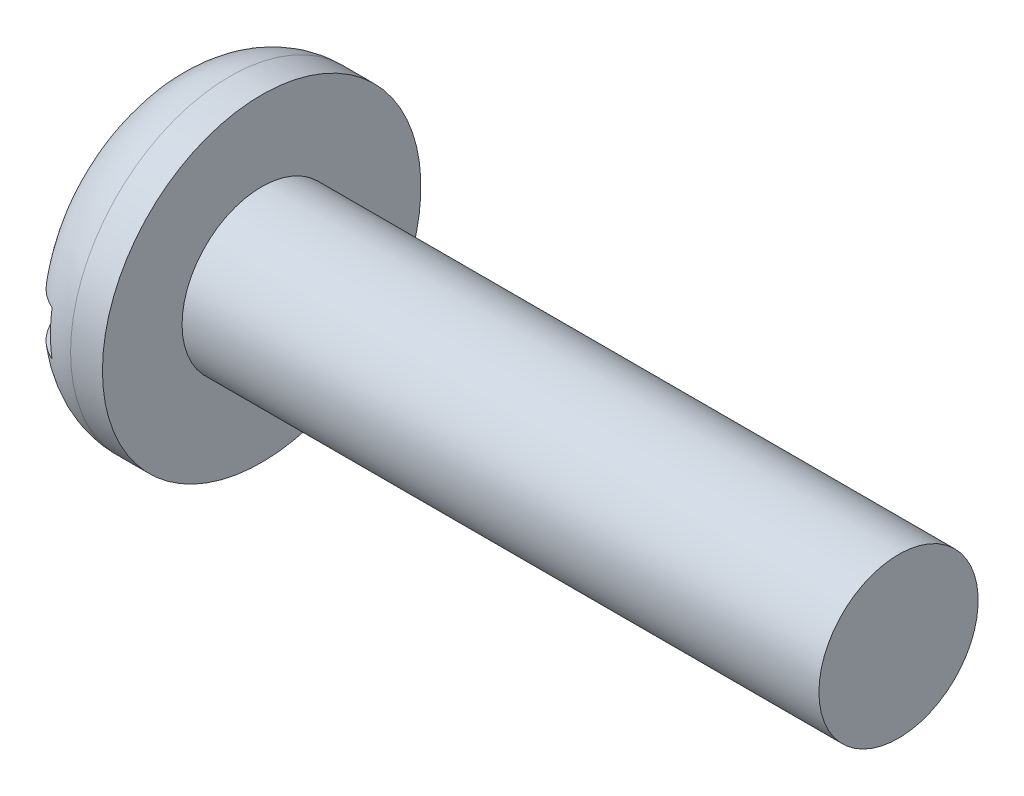
ISO-10303-21;
HEADER;
FILE_DESCRIPTION(('STEP AP214'),'2;1');
FILE_NAME('part.step','',(''),(''),'','','');
FILE_SCHEMA(('AUTOMOTIVE_DESIGN { 1 0 10303 214 1 1 1 1 }'));
ENDSEC;
DATA;
#1=APPLICATION_CONTEXT('core data for automotive mechanical design processes');
#2=APPLICATION_PROTOCOL_DEFINITION('international standard','automotive_design',2000,#1);
#3=PRODUCT_CONTEXT('',#1,'mechanical');
#4=PRODUCT('Part','Part','',(#3));
#5=PRODUCT_RELATED_PRODUCT_CATEGORY('part','',(#4));
#6=PRODUCT_DEFINITION_FORMATION('','',#4);
#7=PRODUCT_DEFINITION_CONTEXT('part definition',#1,'design');
#8=PRODUCT_DEFINITION('design','',#6,#7);
#9=PRODUCT_DEFINITION_SHAPE('','',#8);
#10=(LENGTH_UNIT() NAMED_UNIT(*) SI_UNIT(.MILLI.,.METRE.));
#11=(NAMED_UNIT(*) PLANE_ANGLE_UNIT() SI_UNIT($,.RADIAN.));
#12=(NAMED_UNIT(*) SI_UNIT($,.STERADIAN.) SOLID_ANGLE_UNIT());
#13=UNCERTAINTY_MEASURE_WITH_UNIT(LENGTH_MEASURE(1.E-05),#10,'distance_accuracy_value','');
#14=(GEOMETRIC_REPRESENTATION_CONTEXT(3) GLOBAL_UNCERTAINTY_ASSIGNED_CONTEXT((#13)) GLOBAL_UNIT_ASSIGNED_CONTEXT((#10,
#11,#12)) REPRESENTATION_CONTEXT('',''));
#15=CARTESIAN_POINT('',(0.,0.,0.));
#16=DIRECTION('',(0.,0.,1.));
#17=DIRECTION('',(1.,0.,0.));
#18=AXIS2_PLACEMENT_3D('',#15,#16,#17);
#19=CARTESIAN_POINT('',(0.,0.,0.));
#20=DIRECTION('',(-1.,0.,0.));
#21=DIRECTION('',(0.,0.,1.));
#22=AXIS2_PLACEMENT_3D('',#19,#20,#21);
#23=PLANE('',#22);
#24=DIRECTION('',(0.,0.,-1.));
#25=VECTOR('',#24,1.);
#26=CARTESIAN_POINT('',(0.,1.4,10.));
#27=LINE('',#26,#25);
#28=CARTESIAN_POINT('',(0.,1.4,5.83438085832593));
#29=VERTEX_POINT('',#28);
#30=CARTESIAN_POINT('',(0.,1.4,-5.83438085832593));
#31=VERTEX_POINT('',#30);
#32=EDGE_CURVE('E89',#29,#31,#27,.T.);
#33=ORIENTED_EDGE('',*,*,#32,.F.);
#34=CARTESIAN_POINT('',(0.,0.,0.));
#35=DIRECTION('',(-1.,0.,0.));
#36=DIRECTION('',(0.,0.,1.));
#37=AXIS2_PLACEMENT_3D('',#34,#35,#36);
#38=CIRCLE('',#37,6.);
#39=EDGE_CURVE('E95',#29,#31,#38,.T.);
#40=ORIENTED_EDGE('',*,*,#39,.T.);
#41=EDGE_LOOP('',(#33,#40));
#42=FACE_BOUND('',#41,.T.);
#43=ADVANCED_FACE('F32',(#42),#23,.T.);
#44=CARTESIAN_POINT('',(-25.4,0.,0.));
#45=DIRECTION('',(-1.,0.,0.));
#46=DIRECTION('',(0.,0.,1.));
#47=AXIS2_PLACEMENT_3D('',#44,#45,#46);
#48=CYLINDRICAL_SURFACE('',#47,5.);
#49=CARTESIAN_POINT('',(46.,0.,0.));
#50=DIRECTION('',(-1.,0.,0.));
#51=DIRECTION('',(0.,0.,1.));
#52=AXIS2_PLACEMENT_3D('',#49,#50,#51);
#53=CIRCLE('',#52,5.);
#54=CARTESIAN_POINT('',(46.,0.,5.));
#55=VERTEX_POINT('',#54);
#56=EDGE_CURVE('E99',#55,#55,#53,.T.);
#57=ORIENTED_EDGE('',*,*,#56,.T.);
#58=EDGE_LOOP('',(#57));
#59=FACE_BOUND('',#58,.T.);
#60=CARTESIAN_POINT('',(6.,0.,0.));
#61=DIRECTION('',(-1.,0.,0.));
#62=DIRECTION('',(0.,0.,1.));
#63=AXIS2_PLACEMENT_3D('',#60,#61,#62);
#64=CIRCLE('',#63,5.);
#65=CARTESIAN_POINT('',(6.,0.,5.));
#66=VERTEX_POINT('',#65);
#67=EDGE_CURVE('E131',#66,#66,#64,.T.);
#68=ORIENTED_EDGE('',*,*,#67,.F.);
#69=EDGE_LOOP('',(#68));
#70=FACE_BOUND('',#69,.T.);
#71=ADVANCED_FACE('F34',(#59,#70),#48,.T.);
#72=CARTESIAN_POINT('',(46.,5.,0.));
#73=DIRECTION('',(1.,0.,0.));
#74=DIRECTION('',(0.,0.,-1.));
#75=AXIS2_PLACEMENT_3D('',#72,#73,#74);
#76=PLANE('',#75);
#77=ORIENTED_EDGE('',*,*,#56,.F.);
#78=EDGE_LOOP('',(#77));
#79=FACE_BOUND('',#78,.T.);
#80=ADVANCED_FACE('F150',(#79),#76,.T.);
#81=DIRECTION('',(0.,0.,1.));
#82=VECTOR('',#81,1.);
#83=CARTESIAN_POINT('',(0.,-1.4,-10.));
#84=LINE('',#83,#82);
#85=CARTESIAN_POINT('',(0.,-1.4,-5.83438085832593));
#86=VERTEX_POINT('',#85);
#87=CARTESIAN_POINT('',(0.,-1.4,5.83438085832593));
#88=VERTEX_POINT('',#87);
#89=EDGE_CURVE('E77',#86,#88,#84,.T.);
#90=ORIENTED_EDGE('',*,*,#89,.F.);
#91=EDGE_CURVE('E88',#86,#88,#38,.T.);
#92=ORIENTED_EDGE('',*,*,#91,.T.);
#93=EDGE_LOOP('',(#90,#92));
#94=FACE_BOUND('',#93,.T.);
#95=ADVANCED_FACE('F87',(#94),#23,.T.);
#96=CARTESIAN_POINT('',(4.,0.,0.));
#97=DIRECTION('',(-1.,0.,0.));
#98=DIRECTION('',(0.,0.,1.));
#99=AXIS2_PLACEMENT_3D('',#96,#97,#98);
#100=TOROIDAL_SURFACE('',#99,6.,4.);
#101=CARTESIAN_POINT('',(2.82388760989723,1.4,1.66688763160971));
#102=CARTESIAN_POINT('',(2.99591057931466,1.4,1.59780455340578));
#103=CARTESIAN_POINT('',(3.17324641192669,1.4,1.54138487693918));
#104=CARTESIAN_POINT('',(3.44431983382494,1.4,1.48071678656984));
#105=CARTESIAN_POINT('',(3.53545417429692,1.4,1.46449078681347));
#106=CARTESIAN_POINT('',(3.71886318682712,1.4,1.44064962920626));
#107=CARTESIAN_POINT('',(3.81113770290447,1.4,1.43303330641557));
#108=CARTESIAN_POINT('',(3.99350456293142,1.4,1.42687715764122));
#109=CARTESIAN_POINT('',(4.08358896143869,1.4,1.4280990747782));
#110=CARTESIAN_POINT('',(4.26324158970575,1.4,1.43899537591463));
#111=CARTESIAN_POINT('',(4.3528098095658,1.4,1.44866992148694));
#112=CARTESIAN_POINT('',(4.5308965020747,1.4,1.47606318963219));
#113=CARTESIAN_POINT('',(4.61941221388457,1.4,1.49379966160814));
#114=CARTESIAN_POINT('',(4.79464932813321,1.4,1.53664349533482));
#115=CARTESIAN_POINT('',(4.88137015134344,1.4,1.56175319799052));
#116=CARTESIAN_POINT('',(5.07409548385438,1.4,1.62572381254825));
#117=CARTESIAN_POINT('',(5.17947939906256,1.4,1.66645421365545));
#118=CARTESIAN_POINT('',(5.38629884086466,1.4,1.75692315227251));
#119=CARTESIAN_POINT('',(5.48773323670351,1.4,1.80666424685421));
#120=CARTESIAN_POINT('',(5.68639921418838,1.4,1.9141326618098));
#121=CARTESIAN_POINT('',(5.78362651992467,1.4,1.97186786792857));
#122=CARTESIAN_POINT('',(5.97343201594497,1.4,2.09445578402094));
#123=CARTESIAN_POINT('',(6.06601059667279,1.4,2.15930789478741));
#124=CARTESIAN_POINT('',(6.3410225134084,1.4,2.36717873800974));
#125=CARTESIAN_POINT('',(6.51565728465416,1.4,2.52072958391096));
#126=CARTESIAN_POINT('',(6.84075526935749,1.4,2.85122113548486));
#127=CARTESIAN_POINT('',(6.991232882299,1.4,3.02814779188773));
#128=CARTESIAN_POINT('',(7.28585358037441,1.4,3.43133954884758));
#129=CARTESIAN_POINT('',(7.42540235908466,1.4,3.66100173289964));
#130=CARTESIAN_POINT('',(7.6621109677968,1.4,4.14138729339455));
#131=CARTESIAN_POINT('',(7.75925712914974,1.4,4.39211743016037));
#132=CARTESIAN_POINT('',(7.90345477277527,1.4,4.896570698268));
#133=CARTESIAN_POINT('',(7.95238998776062,1.4,5.14975345905324));
#134=CARTESIAN_POINT('',(8.0041504590733,1.4,5.66077776020977));
#135=CARTESIAN_POINT('',(8.00699532123856,1.4,5.91861727297005));
#136=CARTESIAN_POINT('',(7.96674840043548,1.4,6.41533887586256));
#137=CARTESIAN_POINT('',(7.92635894202319,1.4,6.65444141983588));
#138=CARTESIAN_POINT('',(7.80439510659358,1.4,7.12191135677228));
#139=CARTESIAN_POINT('',(7.72282979237482,1.4,7.35028109993771));
#140=CARTESIAN_POINT('',(7.52443658158668,1.4,7.78063057354644));
#141=CARTESIAN_POINT('',(7.40906711365287,1.4,7.98328350452566));
#142=CARTESIAN_POINT('',(7.14522379940092,1.4,8.36575641080852));
#143=CARTESIAN_POINT('',(6.99675450485219,1.4,8.54557952025606));
#144=CARTESIAN_POINT('',(6.67451507380168,1.4,8.87321576798165));
#145=CARTESIAN_POINT('',(6.50136764199799,1.4,9.02164171151668));
#146=CARTESIAN_POINT('',(6.13235201765611,1.4,9.28688671015458));
#147=CARTESIAN_POINT('',(5.93648551246568,1.4,9.40370811038515));
#148=CARTESIAN_POINT('',(5.53018839943264,1.4,9.60100138395724));
#149=CARTESIAN_POINT('',(5.31996441716839,1.4,9.68189897140146));
#150=CARTESIAN_POINT('',(4.88887041298351,1.4,9.80700967214181));
#151=CARTESIAN_POINT('',(4.66800081274368,1.4,9.85122423721807));
#152=CARTESIAN_POINT('',(4.22332236587566,1.4,9.90150065484593));
#153=CARTESIAN_POINT('',(3.99953945469416,1.4,9.907792172745));
#154=CARTESIAN_POINT('',(3.55410513639755,1.4,9.88265209160338));
#155=CARTESIAN_POINT('',(3.33245369449512,1.4,9.85122110928176));
#156=CARTESIAN_POINT('',(2.89792053757131,1.4,9.75163965230925));
#157=CARTESIAN_POINT('',(2.68502592494758,1.4,9.68354542652615));
#158=CARTESIAN_POINT('',(2.27364991979039,1.4,9.51267018492167));
#159=CARTESIAN_POINT('',(2.07516856849607,1.4,9.40988906985912));
#160=CARTESIAN_POINT('',(1.69766712151978,1.4,9.17232718829837));
#161=CARTESIAN_POINT('',(1.51869880448473,1.4,9.03746416680455));
#162=CARTESIAN_POINT('',(1.18574635195351,1.4,8.7398042150448));
#163=CARTESIAN_POINT('',(1.03176275117384,1.4,8.57700668708509));
#164=CARTESIAN_POINT('',(0.751887385702655,1.4,8.2268843068634));
#165=CARTESIAN_POINT('',(0.626208203043075,1.4,8.03938958754564));
#166=CARTESIAN_POINT('',(0.407636138992179,1.4,7.64619129053692));
#167=CARTESIAN_POINT('',(0.314744623747328,1.4,7.44048695456202));
#168=CARTESIAN_POINT('',(0.162915294710625,1.4,7.01375108185335));
#169=CARTESIAN_POINT('',(0.10445804200566,1.4,6.7925487133289));
#170=CARTESIAN_POINT('',(0.0246071874035577,1.4,6.34357039344767));
#171=CARTESIAN_POINT('',(0.00321715217936811,1.4,6.11579381165209));
#172=CARTESIAN_POINT('',(-0.00260977870431626,1.4,5.65445815132924));
#173=CARTESIAN_POINT('',(0.0138288972861322,1.4,5.42088837535504));
#174=CARTESIAN_POINT('',(0.0842064096773137,1.4,4.95952659740874));
#175=CARTESIAN_POINT('',(0.138146650916431,1.4,4.73173481221612));
#176=CARTESIAN_POINT('',(0.28394368538233,1.4,4.27900664215998));
#177=CARTESIAN_POINT('',(0.377170911905739,1.4,4.05451217585329));
#178=CARTESIAN_POINT('',(0.598005513985871,1.4,3.62307062595052));
#179=CARTESIAN_POINT('',(0.725636172487096,1.4,3.41613555104563));
#180=CARTESIAN_POINT('',(1.01956818834906,1.4,3.01282914246515));
#181=CARTESIAN_POINT('',(1.18768936869895,1.4,2.81777574721764));
#182=CARTESIAN_POINT('',(1.46132201501043,1.4,2.54744642868095));
#183=CARTESIAN_POINT('',(1.55610821335556,1.4,2.46104499674265));
#184=CARTESIAN_POINT('',(1.75234214539796,1.4,2.29618994189214));
#185=CARTESIAN_POINT('',(1.85378794357565,1.4,2.21773402643465));
#186=CARTESIAN_POINT('',(2.09295468801349,1.4,2.04817600435863));
#187=CARTESIAN_POINT('',(2.23271858893909,1.4,1.95992449249366));
#188=CARTESIAN_POINT('',(2.52154246073754,1.4,1.80005555771968));
#189=CARTESIAN_POINT('',(2.67060589008168,1.4,1.72844437064934));
#190=CARTESIAN_POINT('',(2.82388760989723,1.4,1.66688763160971));
#191=B_SPLINE_CURVE_WITH_KNOTS('',3,(#101,#102,#103,#104,#105,#106,#107,#108,#109,#110,#111,
#112,#113,#114,#115,#116,#117,#118,#119,#120,#121,#122,#123,#124,#125,#126,#127,#128,#129,#130,
#131,#132,#133,#134,#135,#136,#137,#138,#139,#140,#141,#142,#143,#144,#145,#146,#147,#148,#149,
#150,#151,#152,#153,#154,#155,#156,#157,#158,#159,#160,#161,#162,#163,#164,#165,#166,#167,#168,
#169,#170,#171,#172,#173,#174,#175,#176,#177,#178,#179,#180,#181,#182,#183,#184,#185,#186,#187,
#188,#189,#190),.UNSPECIFIED.,.T.,.F.,(4,2,2,2,2,2,2,2,2,2,2,2,2,2,2,2,2,2,2,2,2,2,2,2,2,2,2,2,
2,2,2,2,2,2,2,2,2,2,2,2,2,2,2,2,4),(0.,0.555533385012558,0.832895191919914,1.11021946565253,
1.38009618381553,1.64997806081267,1.92045701840144,2.19102194256493,2.52946853416189,
2.86801132166873,3.20689047401699,3.54574111632514,4.24063810101547,4.93511932438331,
5.73720882308924,6.53955668786285,7.30913863277699,8.07839320559907,8.80222860269583,
9.52590475316601,10.222069512648,10.9181385970363,11.599020499766,12.279851865672,
12.9523844545816,13.6248904258361,14.2933195158243,14.961737677922,15.6291332606744,
16.2965307528997,16.9656581909705,17.6347999476467,18.3088111278799,18.9828503884677,
19.6660863186296,20.3493879873063,21.048663717449,21.7479656444268,22.4739960680922,
23.2005190807562,23.9693716313431,24.3537991474319,24.7381154254979,25.2329404227145,
25.7279505539666),.UNSPECIFIED.);
#192=CARTESIAN_POINT('',(2.4,1.4,9.56413752889282));
#193=VERTEX_POINT('',#192);
#194=EDGE_CURVE('E11',#193,#29,#191,.T.);
#195=ORIENTED_EDGE('',*,*,#194,.F.);
#196=CARTESIAN_POINT('',(2.4,0.,0.));
#197=DIRECTION('',(1.,0.,0.));
#198=DIRECTION('',(0.,0.,-1.));
#199=AXIS2_PLACEMENT_3D('',#196,#197,#198);
#200=CIRCLE('',#199,9.66606055596467);
#201=CARTESIAN_POINT('',(2.4,-1.4,9.56413752889282));
#202=VERTEX_POINT('',#201);
#203=EDGE_CURVE('E107',#202,#193,#200,.F.);
#204=ORIENTED_EDGE('',*,*,#203,.F.);
#205=CARTESIAN_POINT('',(2.82388760989723,-1.4,1.66688763160971));
#206=CARTESIAN_POINT('',(2.71540202452825,-1.4,1.71047129507595));
#207=CARTESIAN_POINT('',(2.60898579971927,-1.4,1.75910359728885));
#208=CARTESIAN_POINT('',(2.40061681431915,-1.4,1.8652179313395));
#209=CARTESIAN_POINT('',(2.29866610921061,-1.4,1.92270398470915));
#210=CARTESIAN_POINT('',(2.09948783374248,-1.4,2.04561495646489));
#211=CARTESIAN_POINT('',(2.00226689250272,-1.4,2.11105059197466));
#212=CARTESIAN_POINT('',(1.81307952903431,-1.4,2.2490440890604));
#213=CARTESIAN_POINT('',(1.72111244166065,-1.4,2.32160104589202));
#214=CARTESIAN_POINT('',(1.44651086463947,-1.4,2.55519423519793));
#215=CARTESIAN_POINT('',(1.27305430967287,-1.4,2.72726611619553));
#216=CARTESIAN_POINT('',(0.954530662924008,-1.4,3.0956226000233));
#217=CARTESIAN_POINT('',(0.809446962600361,-1.4,3.29189292749512));
#218=CARTESIAN_POINT('',(0.539044562280082,-1.4,3.72510352655762));
#219=CARTESIAN_POINT('',(0.41705555801857,-1.4,3.96414444235658));
#220=CARTESIAN_POINT('',(0.217486658638567,-1.4,4.46022105745683));
#221=CARTESIAN_POINT('',(0.139912460522645,-1.4,4.71725906046682));
#222=CARTESIAN_POINT('',(0.036055062269157,-1.4,5.22733248554926));
#223=CARTESIAN_POINT('',(0.00727059096522792,-1.4,5.47985761753711));
#224=CARTESIAN_POINT('',(-0.00483928123417192,-1.4,5.98598968892168));
#225=CARTESIAN_POINT('',(0.0118179352155955,-1.4,6.23959617761553));
#226=CARTESIAN_POINT('',(0.0887000066358876,-1.4,6.7257703033764));
#227=CARTESIAN_POINT('',(0.146473078364667,-1.4,6.95872713267903));
#228=CARTESIAN_POINT('',(0.301685409429632,-1.4,7.41103618882651));
#229=CARTESIAN_POINT('',(0.39911653101937,-1.4,7.63039119610125));
#230=CARTESIAN_POINT('',(0.627106210559754,-1.4,8.0414555283909));
#231=CARTESIAN_POINT('',(0.756432217422359,-1.4,8.23384917241329));
#232=CARTESIAN_POINT('',(1.04614095994533,-1.4,8.59363288623071));
#233=CARTESIAN_POINT('',(1.20652002509892,-1.4,8.76102590698964));
#234=CARTESIAN_POINT('',(1.55036681645604,-1.4,9.06271575994388));
#235=CARTESIAN_POINT('',(1.73332861420307,-1.4,9.1975895217532));
#236=CARTESIAN_POINT('',(2.1194964956693,-1.4,9.43431460172465));
#237=CARTESIAN_POINT('',(2.32270123960453,-1.4,9.53616810344438));
#238=CARTESIAN_POINT('',(2.74123726076805,-1.4,9.70289102504211));
#239=CARTESIAN_POINT('',(2.95641615685049,-1.4,9.76814316548236));
#240=CARTESIAN_POINT('',(3.3946994714422,-1.4,9.86139308154713));
#241=CARTESIAN_POINT('',(3.6178036226189,-1.4,9.88939211256069));
#242=CARTESIAN_POINT('',(4.06441079255521,-1.4,9.90726099005743));
#243=CARTESIAN_POINT('',(4.28790623122317,-1.4,9.89732089974912));
#244=CARTESIAN_POINT('',(4.73004701765736,-1.4,9.84003162995927));
#245=CARTESIAN_POINT('',(4.9486924236467,-1.4,9.79268289980676));
#246=CARTESIAN_POINT('',(5.3747961063765,-1.4,9.66201128354121));
#247=CARTESIAN_POINT('',(5.58226150365084,-1.4,9.57871160657014));
#248=CARTESIAN_POINT('',(5.98032786833186,-1.4,9.37858070115127));
#249=CARTESIAN_POINT('',(6.17092872811788,-1.4,9.26174925874149));
#250=CARTESIAN_POINT('',(6.53061319778244,-1.4,8.99748598291685));
#251=CARTESIAN_POINT('',(6.69961881480171,-1.4,8.84994802634061));
#252=CARTESIAN_POINT('',(7.01070808059898,-1.4,8.52880560641576));
#253=CARTESIAN_POINT('',(7.15279100727618,-1.4,8.35520044413531));
#254=CARTESIAN_POINT('',(7.40735991456534,-1.4,7.98533317595888));
#255=CARTESIAN_POINT('',(7.51958543397574,-1.4,7.78889187795062));
#256=CARTESIAN_POINT('',(7.71001696655518,-1.4,7.38017669392034));
#257=CARTESIAN_POINT('',(7.78822142316333,-1.4,7.16790208399947));
#258=CARTESIAN_POINT('',(7.90980483053305,-1.4,6.73009505041085));
#259=CARTESIAN_POINT('',(7.95262978055221,-1.4,6.50440895460741));
#260=CARTESIAN_POINT('',(8.00079716532158,-1.4,6.04909194258102));
#261=CARTESIAN_POINT('',(8.00613567333647,-1.4,5.8194606156174));
#262=CARTESIAN_POINT('',(7.97952886859071,-1.4,5.35637788278586));
#263=CARTESIAN_POINT('',(7.94660783178718,-1.4,5.12298297834878));
#264=CARTESIAN_POINT('',(7.84366216557161,-1.4,4.66457814281171));
#265=CARTESIAN_POINT('',(7.77363428064585,-1.4,4.4395689492737));
#266=CARTESIAN_POINT('',(7.59554777045382,-1.4,3.99405428467082));
#267=CARTESIAN_POINT('',(7.48600437908181,-1.4,3.77414292976772));
#268=CARTESIAN_POINT('',(7.23359578076122,-1.4,3.35435833751963));
#269=CARTESIAN_POINT('',(7.09071366955495,-1.4,3.15449533936725));
#270=CARTESIAN_POINT('',(6.76629368371998,-1.4,2.76755988242133));
#271=CARTESIAN_POINT('',(6.58293445043259,-1.4,2.58200264152373));
#272=CARTESIAN_POINT('',(6.28727477861863,-1.4,2.32796845748048));
#273=CARTESIAN_POINT('',(6.18520562127548,-1.4,2.24729246178138));
#274=CARTESIAN_POINT('',(5.97464493240289,-1.4,2.09477363099254));
#275=CARTESIAN_POINT('',(5.86615500521046,-1.4,2.02292860302699));
#276=CARTESIAN_POINT('',(5.66925974150727,-1.4,1.90473580543983));
#277=CARTESIAN_POINT('',(5.5820759247845,-1.4,1.85635056700798));
#278=CARTESIAN_POINT('',(5.40447794304204,-1.4,1.76601481986021));
#279=CARTESIAN_POINT('',(5.3140639537142,-1.4,1.72406396182779));
#280=CARTESIAN_POINT('',(5.03859810655785,-1.4,1.60919639121585));
#281=CARTESIAN_POINT('',(4.84876547853246,-1.4,1.5469220785411));
#282=CARTESIAN_POINT('',(4.57410858481204,-1.4,1.48460548202786));
#283=CARTESIAN_POINT('',(4.4925383258292,-1.4,1.46944399183204));
#284=CARTESIAN_POINT('',(4.32843200209568,-1.4,1.44597569621881));
#285=CARTESIAN_POINT('',(4.24589649609836,-1.4,1.43766510662425));
#286=CARTESIAN_POINT('',(4.08047397493977,-1.4,1.42822487288097));
#287=CARTESIAN_POINT('',(3.99758725753037,-1.4,1.42709003414336));
#288=CARTESIAN_POINT('',(3.83204246245769,-1.4,1.43202135926205));
#289=CARTESIAN_POINT('',(3.74938438241384,-1.4,1.43808744785738));
#290=CARTESIAN_POINT('',(3.52259683659682,-1.4,1.46445228987051));
#291=CARTESIAN_POINT('',(3.37927427323706,-1.4,1.49204691003426));
#292=CARTESIAN_POINT('',(3.09752035444667,-1.4,1.566090404254));
#293=CARTESIAN_POINT('',(2.95909676596666,-1.4,1.61256787718666));
#294=CARTESIAN_POINT('',(2.82388760989723,-1.4,1.66688763160971));
#295=B_SPLINE_CURVE_WITH_KNOTS('',3,(#205,#206,#207,#208,#209,#210,#211,#212,#213,#214,#215,
#216,#217,#218,#219,#220,#221,#222,#223,#224,#225,#226,#227,#228,#229,#230,#231,#232,#233,#234,
#235,#236,#237,#238,#239,#240,#241,#242,#243,#244,#245,#246,#247,#248,#249,#250,#251,#252,#253,
#254,#255,#256,#257,#258,#259,#260,#261,#262,#263,#264,#265,#266,#267,#268,#269,#270,#271,#272,
#273,#274,#275,#276,#277,#278,#279,#280,#281,#282,#283,#284,#285,#286,#287,#288,#289,#290,#291,
#292,#293,#294),.UNSPECIFIED.,.T.,.F.,(4,2,2,2,2,2,2,2,2,2,2,2,2,2,2,2,2,2,2,2,2,2,2,2,2,2,2,2,
2,2,2,2,2,2,2,2,2,2,2,2,2,2,2,2,4),(0.,0.350573388336655,0.701306485557844,1.05251777830581,
1.40368450823893,2.13355222263584,2.86299140902217,3.663905675308,4.46492265033906,
5.22347169808588,5.98173062132816,6.69819887505765,7.41452018510004,8.10660215904686,
8.79860237800255,9.47723334057524,10.1558194176077,10.827170900931,11.4984997598707,
12.1664698946485,12.8344320063117,13.5019635398255,14.1694993328688,14.8393816546796,
15.5092819410437,16.1848475309449,16.8604440266534,17.546429121203,18.2324860721777,
18.9364304738716,19.6404366453008,20.3742522328892,21.1084407102603,21.8872427363515,
22.2771931460011,22.6670465280319,22.9659181627282,23.2647735662154,23.8605401422209,
24.1092214999252,24.3577654032836,24.6061293629154,24.8544907267774,25.290758656433,
25.7276898101543),.UNSPECIFIED.);
#296=EDGE_CURVE('E44',#88,#202,#295,.T.);
#297=ORIENTED_EDGE('',*,*,#296,.F.);
#298=ORIENTED_EDGE('',*,*,#91,.F.);
#299=CARTESIAN_POINT('',(1.60255767297242,-1.4,-9.09479357609038));
#300=CARTESIAN_POINT('',(1.42201008536315,-1.4,-8.95800797003229));
#301=CARTESIAN_POINT('',(1.25307546942279,-1.4,-8.80577767195026));
#302=CARTESIAN_POINT('',(0.943242566642216,-1.4,-8.4749624035541));
#303=CARTESIAN_POINT('',(0.802359459693463,-1.4,-8.29636325444888));
#304=CARTESIAN_POINT('',(0.552596529870495,-1.4,-7.91824740538796));
#305=CARTESIAN_POINT('',(0.443691686416513,-1.4,-7.71874722564059));
#306=CARTESIAN_POINT('',(0.260496913259654,-1.4,-7.30449201845102));
#307=CARTESIAN_POINT('',(0.186203757769691,-1.4,-7.08973841476896));
#308=CARTESIAN_POINT('',(0.0731519410167488,-1.4,-6.64832941946597));
#309=CARTESIAN_POINT('',(0.0348321587462856,-1.4,-6.42156181194134));
#310=CARTESIAN_POINT('',(-0.00424272830208719,-1.4,-5.96482904216432));
#311=CARTESIAN_POINT('',(-0.00499316066149482,-1.4,-5.73486348574744));
#312=CARTESIAN_POINT('',(0.0308667465921254,-1.4,-5.27164914331708));
#313=CARTESIAN_POINT('',(0.068484020206616,-1.4,-5.0384787809859));
#314=CARTESIAN_POINT('',(0.180679206265916,-1.4,-4.58126704494831));
#315=CARTESIAN_POINT('',(0.255259651582657,-1.4,-4.35722629798027));
#316=CARTESIAN_POINT('',(0.442477896377204,-1.4,-3.91412338164406));
#317=CARTESIAN_POINT('',(0.556629891187811,-1.4,-3.69570158607769));
#318=CARTESIAN_POINT('',(0.817950647544551,-1.4,-3.27956502663269));
#319=CARTESIAN_POINT('',(0.965139588672626,-1.4,-3.08186302752178));
#320=CARTESIAN_POINT('',(1.29817914421442,-1.4,-2.69992259019512));
#321=CARTESIAN_POINT('',(1.48584947858219,-1.4,-2.51725759155172));
#322=CARTESIAN_POINT('',(1.78770407397439,-1.4,-2.26826503457458));
#323=CARTESIAN_POINT('',(1.89178677015888,-1.4,-2.18939264193677));
#324=CARTESIAN_POINT('',(2.1063041916132,-1.4,-2.04077370839955));
#325=CARTESIAN_POINT('',(2.21673709259576,-1.4,-1.97102456524203));
#326=CARTESIAN_POINT('',(2.41459328494011,-1.4,-1.85824654309443));
#327=CARTESIAN_POINT('',(2.5007224817448,-1.4,-1.8129343054169));
#328=CARTESIAN_POINT('',(2.67606955692801,-1.4,-1.72862585228166));
#329=CARTESIAN_POINT('',(2.76528827945862,-1.4,-1.68963137982178));
#330=CARTESIAN_POINT('',(2.94631404488213,-1.4,-1.61884234358615));
#331=CARTESIAN_POINT('',(3.03811459119184,-1.4,-1.58703125909648));
#332=CARTESIAN_POINT('',(3.22407188454177,-1.4,-1.53141978448824));
#333=CARTESIAN_POINT('',(3.31822699376215,-1.4,-1.50761398379161));
#334=CARTESIAN_POINT('',(3.49434437427975,-1.4,-1.47176051073926));
#335=CARTESIAN_POINT('',(3.57605897160877,-1.4,-1.4584971530621));
#336=CARTESIAN_POINT('',(3.74031547754424,-1.4,-1.438907960158));
#337=CARTESIAN_POINT('',(3.82285726982039,-1.4,-1.4325811628684));
#338=CARTESIAN_POINT('',(3.98813480760348,-1.4,-1.42711628192624));
#339=CARTESIAN_POINT('',(4.07087042023998,-1.4,-1.42797421548019));
#340=CARTESIAN_POINT('',(4.23595842372561,-1.4,-1.43683362180005));
#341=CARTESIAN_POINT('',(4.31831079079688,-1.4,-1.44483553201637));
#342=CARTESIAN_POINT('',(4.48166303315493,-1.4,-1.46761888914219));
#343=CARTESIAN_POINT('',(4.56266750111335,-1.4,-1.48236763296635));
#344=CARTESIAN_POINT('',(4.72328923915119,-1.4,-1.51814503362565));
#345=CARTESIAN_POINT('',(4.80290588644188,-1.4,-1.53917643675398));
#346=CARTESIAN_POINT('',(5.03940009231485,-1.4,-1.61091872175734));
#347=CARTESIAN_POINT('',(5.19372287017596,-1.4,-1.67024755730901));
#348=CARTESIAN_POINT('',(5.45636530137581,-1.4,-1.79049182266326));
#349=CARTESIAN_POINT('',(5.56660362973368,-1.4,-1.84736620603104));
#350=CARTESIAN_POINT('',(5.78184901690606,-1.4,-1.97038786382953));
#351=CARTESIAN_POINT('',(5.88685392275922,-1.4,-2.03653891257037));
#352=CARTESIAN_POINT('',(6.09120381285994,-1.4,-2.17715875769361));
#353=CARTESIAN_POINT('',(6.19054579649256,-1.4,-2.25163190296669));
#354=CARTESIAN_POINT('',(6.38308984692614,-1.4,-2.40815422189779));
#355=CARTESIAN_POINT('',(6.47628952033903,-1.4,-2.49020631918139));
#356=CARTESIAN_POINT('',(6.74852639932835,-1.4,-2.74935686280159));
#357=CARTESIAN_POINT('',(6.91732908666946,-1.4,-2.93746304647531));
#358=CARTESIAN_POINT('',(7.2227588123905,-1.4,-3.33792131199347));
#359=CARTESIAN_POINT('',(7.3594051898969,-1.4,-3.55025870624476));
#360=CARTESIAN_POINT('',(7.60262273614547,-1.4,-4.00684687735642));
#361=CARTESIAN_POINT('',(7.70712340282122,-1.4,-4.25221113960783));
#362=CARTESIAN_POINT('',(7.87054002832122,-1.4,-4.75778277789481));
#363=CARTESIAN_POINT('',(7.92945417568802,-1.4,-5.01799074332893));
#364=CARTESIAN_POINT('',(7.9963072383659,-1.4,-5.52923174886443));
#365=CARTESIAN_POINT('',(8.00705429086358,-1.4,-5.77989754368356));
#366=CARTESIAN_POINT('',(7.98392268459984,-1.4,-6.27915375683593));
#367=CARTESIAN_POINT('',(7.95006039250812,-1.4,-6.5277449026669));
#368=CARTESIAN_POINT('',(7.84092880886996,-1.4,-7.00233390750714));
#369=CARTESIAN_POINT('',(7.76785410168602,-1.4,-7.22883775845308));
#370=CARTESIAN_POINT('',(7.58353421570229,-1.4,-7.66575004768473));
#371=CARTESIAN_POINT('',(7.47229592454693,-1.4,-7.87616138192357));
#372=CARTESIAN_POINT('',(7.21862966483835,-1.4,-8.26820925622292));
#373=CARTESIAN_POINT('',(7.07725134678306,-1.4,-8.45052554111232));
#374=CARTESIAN_POINT('',(6.76540228333366,-1.4,-8.78830249759966));
#375=CARTESIAN_POINT('',(6.59493462485932,-1.4,-8.9437660152566));
#376=CARTESIAN_POINT('',(6.23297619227514,-1.4,-9.22066727251102));
#377=CARTESIAN_POINT('',(6.04189906393217,-1.4,-9.34264598666134));
#378=CARTESIAN_POINT('',(5.64183077595115,-1.4,-9.55243700229659));
#379=CARTESIAN_POINT('',(5.43284089649973,-1.4,-9.64025174292834));
#380=CARTESIAN_POINT('',(5.00500779995455,-1.4,-9.77842699099935));
#381=CARTESIAN_POINT('',(4.78627596463245,-1.4,-9.82913257251176));
#382=CARTESIAN_POINT('',(4.34337250722166,-1.4,-9.89293876448413));
#383=CARTESIAN_POINT('',(4.11920052989604,-1.4,-9.90603691250942));
#384=CARTESIAN_POINT('',(3.67274189333675,-1.4,-9.8942603272082));
#385=CARTESIAN_POINT('',(3.45045129239439,-1.4,-9.8695331139664));
#386=CARTESIAN_POINT('',(3.01325852270549,-1.4,-9.78310730980823));
#387=CARTESIAN_POINT('',(2.79835276258331,-1.4,-9.72142696678753));
#388=CARTESIAN_POINT('',(2.41367411742895,-1.4,-9.57504093713871));
#389=CARTESIAN_POINT('',(2.242006634324,-1.4,-9.49526102616313));
#390=CARTESIAN_POINT('',(1.91172045244826,-1.4,-9.31216498267295));
#391=CARTESIAN_POINT('',(1.75310205924705,-1.4,-9.20884829921293));
#392=CARTESIAN_POINT('',(1.60255767297242,-1.4,-9.09479357609038));
#393=B_SPLINE_CURVE_WITH_KNOTS('',3,(#299,#300,#301,#302,#303,#304,#305,#306,#307,#308,#309,
#310,#311,#312,#313,#314,#315,#316,#317,#318,#319,#320,#321,#322,#323,#324,#325,#326,#327,#328,
#329,#330,#331,#332,#333,#334,#335,#336,#337,#338,#339,#340,#341,#342,#343,#344,#345,#346,#347,
#348,#349,#350,#351,#352,#353,#354,#355,#356,#357,#358,#359,#360,#361,#362,#363,#364,#365,#366,
#367,#368,#369,#370,#371,#372,#373,#374,#375,#376,#377,#378,#379,#380,#381,#382,#383,#384,#385,
#386,#387,#388,#389,#390,#391,#392),.UNSPECIFIED.,.T.,.F.,(4,2,2,2,2,2,2,2,2,2,2,2,2,2,2,2,2,2,
2,2,2,2,2,2,2,2,2,2,2,2,2,2,2,2,2,2,2,2,2,2,2,2,2,2,2,2,4),(0.,0.678849059517907,
1.35806448131614,2.03674704347372,2.71536634019248,3.40216119556456,4.08904146590991,
4.79442427365324,5.4998554238766,6.23596892480442,6.97253328712737,7.75435096088225,
8.14576003086216,8.5370572131944,8.82880140419636,9.12062594746465,9.411772343118,
9.70272156257872,9.95079958689448,10.1988431998023,10.4467493209812,10.6946706233512,
10.9414027371191,11.1882428613145,11.6825210780863,12.0542404462884,12.4261114936431,
12.7981777870959,13.1703882115597,13.9251731592593,14.6795030049618,15.4753713242601,
16.2712712671083,17.0201104312239,17.7686749311246,18.4791502263043,19.1894973645155,
19.8782746144988,20.5669788178146,21.2437959051892,21.9205646621394,22.5909573583013,
23.261393948992,23.9292224744492,24.5967214897332,25.1627469015969,25.7287855642647),.UNSPECIFIED.);
#394=CARTESIAN_POINT('',(2.4,-1.4,-9.56413752889282));
#395=VERTEX_POINT('',#394);
#396=EDGE_CURVE('E74',#395,#86,#393,.T.);
#397=ORIENTED_EDGE('',*,*,#396,.F.);
#398=CARTESIAN_POINT('',(2.4,1.4,-9.56413752889282));
#399=VERTEX_POINT('',#398);
#400=EDGE_CURVE('E83',#399,#395,#200,.F.);
#401=ORIENTED_EDGE('',*,*,#400,.F.);
#402=CARTESIAN_POINT('',(1.60255767297242,1.4,-9.09479357609038));
#403=CARTESIAN_POINT('',(1.78042975431689,1.4,-9.2295281465334));
#404=CARTESIAN_POINT('',(1.96978024135183,1.4,-9.34943426071059));
#405=CARTESIAN_POINT('',(2.3660869214413,1.4,-9.55589063918149));
#406=CARTESIAN_POINT('',(2.57306606584911,1.4,-9.6423965826507));
#407=CARTESIAN_POINT('',(2.99857871795361,1.4,-9.77934410873789));
#408=CARTESIAN_POINT('',(3.21710812143244,1.4,-9.82979841048389));
#409=CARTESIAN_POINT('',(3.65947725889148,1.4,-9.89316848134617));
#410=CARTESIAN_POINT('',(3.8833154884358,1.4,-9.90609476013125));
#411=CARTESIAN_POINT('',(4.32937519143809,1.4,-9.89407937055961));
#412=CARTESIAN_POINT('',(4.55159938344056,1.4,-9.86923849628621));
#413=CARTESIAN_POINT('',(4.9887293232144,1.4,-9.78260260397781));
#414=CARTESIAN_POINT('',(5.2036348159303,1.4,-9.7208062994423));
#415=CARTESIAN_POINT('',(5.62007554093608,1.4,-9.56206071046876));
#416=CARTESIAN_POINT('',(5.82160882315243,1.4,-9.46510631218531));
#417=CARTESIAN_POINT('',(6.20562912011954,1.4,-9.23887975492805));
#418=CARTESIAN_POINT('',(6.38811599284489,1.4,-9.10960735498952));
#419=CARTESIAN_POINT('',(6.72976890699031,1.4,-8.82185956581247));
#420=CARTESIAN_POINT('',(6.88882880983986,1.4,-8.66325819292745));
#421=CARTESIAN_POINT('',(7.17836018870404,1.4,-8.32182621479912));
#422=CARTESIAN_POINT('',(7.30883080238816,1.4,-8.13899487898127));
#423=CARTESIAN_POINT('',(7.53890520700601,1.4,-7.75246121200751));
#424=CARTESIAN_POINT('',(7.63819977169543,1.4,-7.54857491111647));
#425=CARTESIAN_POINT('',(7.80178101887387,1.4,-7.12723102811438));
#426=CARTESIAN_POINT('',(7.86606602082437,1.4,-6.90977279507815));
#427=CARTESIAN_POINT('',(7.95912225383709,1.4,-6.46351200456785));
#428=CARTESIAN_POINT('',(7.98726680906791,1.4,-6.234578984748));
#429=CARTESIAN_POINT('',(8.00584678539171,1.4,-5.77520536469072));
#430=CARTESIAN_POINT('',(7.99627710474714,1.4,-5.5447645647001));
#431=CARTESIAN_POINT('',(7.93962048008831,1.4,-5.08181122978316));
#432=CARTESIAN_POINT('',(7.89145923216252,1.4,-4.84943069476513));
#433=CARTESIAN_POINT('',(7.75854423897806,1.4,-4.39545851203735));
#434=CARTESIAN_POINT('',(7.67378960934773,1.4,-4.1738671252187));
#435=CARTESIAN_POINT('',(7.4661616563696,1.4,-3.73672348426269));
#436=CARTESIAN_POINT('',(7.34171040144038,1.4,-3.52192124491203));
#437=CARTESIAN_POINT('',(7.06049449552793,1.4,-3.11452077817194));
#438=CARTESIAN_POINT('',(6.90370203935652,1.4,-2.92194188085087));
#439=CARTESIAN_POINT('',(6.55152008813614,1.4,-2.55193442327951));
#440=CARTESIAN_POINT('',(6.35433356007562,1.4,-2.37619922738324));
#441=CARTESIAN_POINT('',(6.03880372792489,1.4,-2.13930999109749));
#442=CARTESIAN_POINT('',(5.930277938222,1.4,-2.06476947328393));
#443=CARTESIAN_POINT('',(5.70704385723627,1.4,-1.92555719128122));
#444=CARTESIAN_POINT('',(5.59233792175926,1.4,-1.86088170216365));
#445=CARTESIAN_POINT('',(5.39211678800477,1.4,-1.76031232502714));
#446=CARTESIAN_POINT('',(5.30802347052215,1.4,-1.72156870569054));
#447=CARTESIAN_POINT('',(5.13720265136573,1.4,-1.65029049780539));
#448=CARTESIAN_POINT('',(5.05047460220743,1.4,-1.61775721010559));
#449=CARTESIAN_POINT('',(4.87493674903338,1.4,-1.55975005490798));
#450=CARTESIAN_POINT('',(4.78613329843539,1.4,-1.53425709344772));
#451=CARTESIAN_POINT('',(4.60669151939534,1.4,-1.49103175578914));
#452=CARTESIAN_POINT('',(4.51605426015385,1.4,-1.4732949864342));
#453=CARTESIAN_POINT('',(4.3325663421496,1.4,-1.44614573682539));
#454=CARTESIAN_POINT('',(4.23970248801133,1.4,-1.4368212096957));
#455=CARTESIAN_POINT('',(4.05351092961497,1.4,-1.42727208604535));
#456=CARTESIAN_POINT('',(3.96018326302259,1.4,-1.4270467622858));
#457=CARTESIAN_POINT('',(3.7738555537554,1.4,-1.43571361983544));
#458=CARTESIAN_POINT('',(3.68085594310206,1.4,-1.44461511437909));
#459=CARTESIAN_POINT('',(3.49612734022715,1.4,-1.47109765114762));
#460=CARTESIAN_POINT('',(3.40439858338041,1.4,-1.48868027968384));
#461=CARTESIAN_POINT('',(3.11176900867296,1.4,-1.55819402369267));
#462=CARTESIAN_POINT('',(2.91443474510434,1.4,-1.62584330268311));
#463=CARTESIAN_POINT('',(2.62873446580472,1.4,-1.75012380641824));
#464=CARTESIAN_POINT('',(2.53506897597336,1.4,-1.79544734285052));
#465=CARTESIAN_POINT('',(2.35131494765264,1.4,-1.89293017838253));
#466=CARTESIAN_POINT('',(2.26122663573015,1.4,-1.94508990956771));
#467=CARTESIAN_POINT('',(2.06109825494119,1.4,-2.07049902415253));
#468=CARTESIAN_POINT('',(1.95224243110147,1.4,-2.14563923619398));
#469=CARTESIAN_POINT('',(1.74128623102525,1.4,-2.30484009679364));
#470=CARTESIAN_POINT('',(1.63918726553876,1.4,-2.38890259873779));
#471=CARTESIAN_POINT('',(1.34404347237222,1.4,-2.6531906453739));
#472=CARTESIAN_POINT('',(1.16180033821357,1.4,-2.84573983581594));
#473=CARTESIAN_POINT('',(0.831222247554643,1.4,-3.25920012793012));
#474=CARTESIAN_POINT('',(0.683005116661675,1.4,-3.48020576597342));
#475=CARTESIAN_POINT('',(0.490891742219758,1.4,-3.82815301039261));
#476=CARTESIAN_POINT('',(0.431868366064552,1.4,-3.94693591764274));
#477=CARTESIAN_POINT('',(0.324488499775618,1.4,-4.18921047815267));
#478=CARTESIAN_POINT('',(0.276127555777112,1.4,-4.31270013994834));
#479=CARTESIAN_POINT('',(0.191562716337386,1.4,-4.56077513277534));
#480=CARTESIAN_POINT('',(0.155117438343706,1.4,-4.68527831467413));
#481=CARTESIAN_POINT('',(0.0934293280142878,1.4,-4.93698111091384));
#482=CARTESIAN_POINT('',(0.0681816900959788,1.4,-5.06417954395528));
#483=CARTESIAN_POINT('',(0.0292289683587691,1.4,-5.32033658061442));
#484=CARTESIAN_POINT('',(0.0155240305455429,1.4,-5.44929520647615));
#485=CARTESIAN_POINT('',(-8.31529471846405E-05,1.4,-5.70792154502967));
#486=CARTESIAN_POINT('',(-0.00198632812429333,1.4,-5.83758920107366));
#487=CARTESIAN_POINT('',(0.00590653232336633,1.4,-6.08866537024075));
#488=CARTESIAN_POINT('',(0.0149978252388343,1.4,-6.21009639925311));
#489=CARTESIAN_POINT('',(0.0437445738538976,1.4,-6.4516978888028));
#490=CARTESIAN_POINT('',(0.0633992867063141,1.4,-6.57186843737463));
#491=CARTESIAN_POINT('',(0.113214799616168,1.4,-6.81005241922669));
#492=CARTESIAN_POINT('',(0.143378866998534,1.4,-6.92806516963123));
#493=CARTESIAN_POINT('',(0.214036579011936,1.4,-7.16090604421808));
#494=CARTESIAN_POINT('',(0.254525840730969,1.4,-7.27573549679536));
#495=CARTESIAN_POINT('',(0.343759874928777,1.4,-7.49681283138025));
#496=CARTESIAN_POINT('',(0.392109767930611,1.4,-7.60322025558568));
#497=CARTESIAN_POINT('',(0.497766279006717,1.4,-7.81143762901345));
#498=CARTESIAN_POINT('',(0.555069111497834,1.4,-7.91324949803543));
#499=CARTESIAN_POINT('',(0.678186444941434,1.4,-8.11142156195622));
#500=CARTESIAN_POINT('',(0.743990562045787,1.4,-8.20778820481873));
#501=CARTESIAN_POINT('',(0.88367566849125,1.4,-8.39442269322833));
#502=CARTESIAN_POINT('',(0.957553971746198,1.4,-8.48469255095615));
#503=CARTESIAN_POINT('',(1.12107819222282,1.4,-8.66763294760449));
#504=CARTESIAN_POINT('',(1.21156527599411,1.4,-8.75955486966856));
#505=CARTESIAN_POINT('',(1.40094478874254,1.4,-8.93423081013416));
#506=CARTESIAN_POINT('',(1.49983719502597,1.4,-9.01698485328687));
#507=CARTESIAN_POINT('',(1.60255767297242,1.4,-9.09479357609038));
#508=B_SPLINE_CURVE_WITH_KNOTS('',3,(#402,#403,#404,#405,#406,#407,#408,#409,#410,#411,#412,
#413,#414,#415,#416,#417,#418,#419,#420,#421,#422,#423,#424,#425,#426,#427,#428,#429,#430,#431,
#432,#433,#434,#435,#436,#437,#438,#439,#440,#441,#442,#443,#444,#445,#446,#447,#448,#449,#450,
#451,#452,#453,#454,#455,#456,#457,#458,#459,#460,#461,#462,#463,#464,#465,#466,#467,#468,#469,
#470,#471,#472,#473,#474,#475,#476,#477,#478,#479,#480,#481,#482,#483,#484,#485,#486,#487,#488,
#489,#490,#491,#492,#493,#494,#495,#496,#497,#498,#499,#500,#501,#502,#503,#504,#505,#506,#507),
.UNSPECIFIED.,.T.,.F.,(4,2,2,2,2,2,2,2,2,2,2,2,2,2,2,2,2,2,2,2,2,2,2,2,2,2,2,2,2,2,2,2,2,2,2,2,
2,2,2,2,2,2,2,2,2,2,2,2,2,2,2,2,4),(0.,0.668971742585991,1.338828160498,2.00844813420086,
2.67788056369666,3.34552952587073,4.01320173173932,4.68097109142147,5.34874543017558,
6.01945781439682,6.69019042633877,7.36737976796877,8.04460161336038,8.73341459676803,
9.42232076153264,10.1310999295193,10.8398962279074,11.5813863083853,12.3235165584897,
13.1119202600541,13.5065055244085,13.9009414268191,14.1784994741416,14.4561155965903,
14.7329712365281,15.0096698599127,15.2892290261289,15.5687658489938,15.848588202411,
16.1284617069504,16.7503351050349,17.0623237707587,17.3743321654162,17.7706239251516,
18.1669981664472,18.9585132798197,19.7527292516544,20.1502172924419,20.5475389803488,
20.9362250668352,21.3247441828907,21.7132682133201,22.1017616435116,22.4666188848284,
22.8314504717912,23.1963955850981,23.5611860410271,23.9113888068614,24.2614438947549,
24.6110753823147,24.9605909079794,25.346920691367,25.7332494317274),.UNSPECIFIED.);
#509=EDGE_CURVE('E82',#31,#399,#508,.T.);
#510=ORIENTED_EDGE('',*,*,#509,.F.);
#511=ORIENTED_EDGE('',*,*,#39,.F.);
#512=EDGE_LOOP('',(#195,#204,#297,#298,#397,#401,#510,#511));
#513=FACE_BOUND('',#512,.T.);
#514=CARTESIAN_POINT('',(4.,0.,0.));
#515=DIRECTION('',(-1.,0.,0.));
#516=DIRECTION('',(0.,0.,1.));
#517=AXIS2_PLACEMENT_3D('',#514,#515,#516);
#518=CIRCLE('',#517,10.);
#519=CARTESIAN_POINT('',(4.,0.,10.));
#520=VERTEX_POINT('',#519);
#521=EDGE_CURVE('E96',#520,#520,#518,.T.);
#522=ORIENTED_EDGE('',*,*,#521,.T.);
#523=EDGE_LOOP('',(#522));
#524=FACE_BOUND('',#523,.T.);
#525=ADVANCED_FACE('F92',(#513,#524),#100,.T.);
#526=CARTESIAN_POINT('',(-25.4,0.,0.));
#527=DIRECTION('',(-1.,0.,0.));
#528=DIRECTION('',(0.,0.,1.));
#529=AXIS2_PLACEMENT_3D('',#526,#527,#528);
#530=CYLINDRICAL_SURFACE('',#529,10.);
#531=CARTESIAN_POINT('',(6.,0.,0.));
#532=DIRECTION('',(-1.,0.,0.));
#533=DIRECTION('',(0.,0.,1.));
#534=AXIS2_PLACEMENT_3D('',#531,#532,#533);
#535=CIRCLE('',#534,10.);
#536=CARTESIAN_POINT('',(6.,0.,10.));
#537=VERTEX_POINT('',#536);
#538=EDGE_CURVE('E101',#537,#537,#535,.T.);
#539=ORIENTED_EDGE('',*,*,#538,.T.);
#540=EDGE_LOOP('',(#539));
#541=FACE_BOUND('',#540,.T.);
#542=ORIENTED_EDGE('',*,*,#521,.F.);
#543=EDGE_LOOP('',(#542));
#544=FACE_BOUND('',#543,.T.);
#545=ADVANCED_FACE('F141',(#541,#544),#530,.T.);
#546=CARTESIAN_POINT('',(6.,5.,0.));
#547=DIRECTION('',(-1.,0.,0.));
#548=DIRECTION('',(0.,0.,1.));
#549=AXIS2_PLACEMENT_3D('',#546,#547,#548);
#550=PLANE('',#549);
#551=ORIENTED_EDGE('',*,*,#538,.F.);
#552=EDGE_LOOP('',(#551));
#553=FACE_BOUND('',#552,.T.);
#554=ORIENTED_EDGE('',*,*,#67,.T.);
#555=EDGE_LOOP('',(#554));
#556=FACE_BOUND('',#555,.T.);
#557=ADVANCED_FACE('F144',(#553,#556),#550,.F.);
#558=CARTESIAN_POINT('',(2.4,1.4,10.));
#559=DIRECTION('',(0.,1.,0.));
#560=DIRECTION('',(0.,0.,1.));
#561=AXIS2_PLACEMENT_3D('',#558,#559,#560);
#562=PLANE('',#561);
#563=ORIENTED_EDGE('',*,*,#509,.T.);
#564=DIRECTION('',(0.,0.,-1.));
#565=VECTOR('',#564,1.);
#566=CARTESIAN_POINT('',(2.4,1.4,10.));
#567=LINE('',#566,#565);
#568=EDGE_CURVE('E51',#193,#399,#567,.T.);
#569=ORIENTED_EDGE('',*,*,#568,.F.);
#570=ORIENTED_EDGE('',*,*,#194,.T.);
#571=ORIENTED_EDGE('',*,*,#32,.T.);
#572=EDGE_LOOP('',(#563,#569,#570,#571));
#573=FACE_BOUND('',#572,.T.);
#574=ADVANCED_FACE('F121',(#573),#562,.F.);
#575=CARTESIAN_POINT('',(2.4,-1.4,-10.));
#576=DIRECTION('',(0.,-1.,0.));
#577=DIRECTION('',(0.,0.,-1.));
#578=AXIS2_PLACEMENT_3D('',#575,#576,#577);
#579=PLANE('',#578);
#580=ORIENTED_EDGE('',*,*,#396,.T.);
#581=ORIENTED_EDGE('',*,*,#89,.T.);
#582=ORIENTED_EDGE('',*,*,#296,.T.);
#583=DIRECTION('',(0.,0.,1.));
#584=VECTOR('',#583,1.);
#585=CARTESIAN_POINT('',(2.4,-1.4,-10.));
#586=LINE('',#585,#584);
#587=EDGE_CURVE('E78',#395,#202,#586,.T.);
#588=ORIENTED_EDGE('',*,*,#587,.F.);
#589=EDGE_LOOP('',(#580,#581,#582,#588));
#590=FACE_BOUND('',#589,.T.);
#591=ADVANCED_FACE('F76',(#590),#579,.F.);
#592=CARTESIAN_POINT('',(2.4,-1.4,-10.));
#593=DIRECTION('',(1.,0.,0.));
#594=DIRECTION('',(0.,0.,-1.));
#595=AXIS2_PLACEMENT_3D('',#592,#593,#594);
#596=PLANE('',#595);
#597=ORIENTED_EDGE('',*,*,#203,.T.);
#598=ORIENTED_EDGE('',*,*,#568,.T.);
#599=ORIENTED_EDGE('',*,*,#400,.T.);
#600=ORIENTED_EDGE('',*,*,#587,.T.);
#601=EDGE_LOOP('',(#597,#598,#599,#600));
#602=FACE_BOUND('',#601,.T.);
#603=ADVANCED_FACE('F120',(#602),#596,.F.);
#604=CLOSED_SHELL('',(#43,#71,#80,#95,#525,#545,#557,#574,#591,#603));
#605=MANIFOLD_SOLID_BREP('B2',#604);
#606=ADVANCED_BREP_SHAPE_REPRESENTATION('',(#18,#605),#14);
#607=SHAPE_DEFINITION_REPRESENTATION(#9,#606);
ENDSEC;
END-ISO-10303-21;
